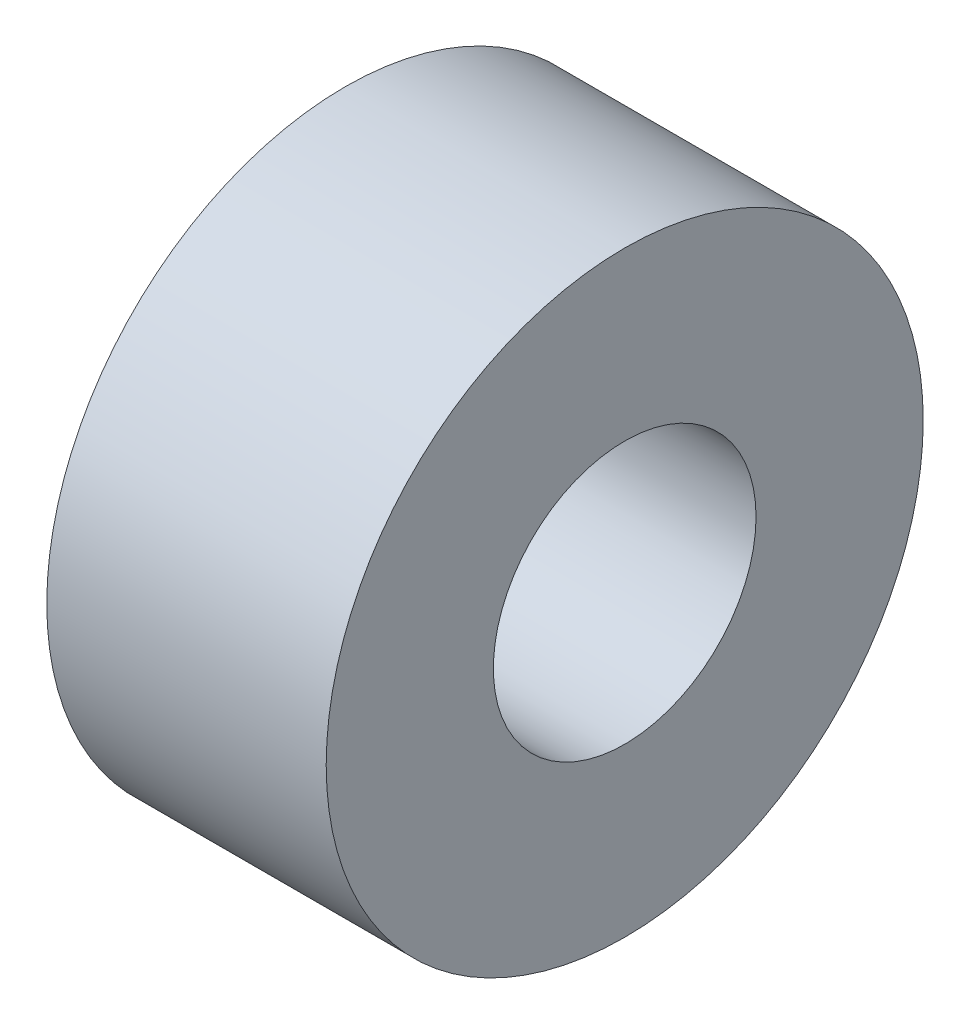
ISO-10303-21;
HEADER;
FILE_DESCRIPTION(('STEP AP214'),'2;1');
FILE_NAME('part.step','',(''),(''),'','','');
FILE_SCHEMA(('AUTOMOTIVE_DESIGN { 1 0 10303 214 1 1 1 1 }'));
ENDSEC;
DATA;
#1=APPLICATION_CONTEXT('core data for automotive mechanical design processes');
#2=APPLICATION_PROTOCOL_DEFINITION('international standard','automotive_design',2000,#1);
#3=PRODUCT_CONTEXT('',#1,'mechanical');
#4=PRODUCT('Part','Part','',(#3));
#5=PRODUCT_RELATED_PRODUCT_CATEGORY('part','',(#4));
#6=PRODUCT_DEFINITION_FORMATION('','',#4);
#7=PRODUCT_DEFINITION_CONTEXT('part definition',#1,'design');
#8=PRODUCT_DEFINITION('design','',#6,#7);
#9=PRODUCT_DEFINITION_SHAPE('','',#8);
#10=(LENGTH_UNIT() NAMED_UNIT(*) SI_UNIT(.MILLI.,.METRE.));
#11=(NAMED_UNIT(*) PLANE_ANGLE_UNIT() SI_UNIT($,.RADIAN.));
#12=(NAMED_UNIT(*) SI_UNIT($,.STERADIAN.) SOLID_ANGLE_UNIT());
#13=UNCERTAINTY_MEASURE_WITH_UNIT(LENGTH_MEASURE(1.E-05),#10,'distance_accuracy_value','');
#14=(GEOMETRIC_REPRESENTATION_CONTEXT(3) GLOBAL_UNCERTAINTY_ASSIGNED_CONTEXT((#13)) GLOBAL_UNIT_ASSIGNED_CONTEXT((#10,
#11,#12)) REPRESENTATION_CONTEXT('',''));
#15=CARTESIAN_POINT('',(0.,0.,0.));
#16=DIRECTION('',(0.,0.,1.));
#17=DIRECTION('',(1.,0.,0.));
#18=AXIS2_PLACEMENT_3D('',#15,#16,#17);
#19=CARTESIAN_POINT('',(2.9718,0.,0.));
#20=DIRECTION('',(1.,0.,0.));
#21=DIRECTION('',(0.,0.,-1.));
#22=AXIS2_PLACEMENT_3D('',#19,#20,#21);
#23=PLANE('',#22);
#24=CARTESIAN_POINT('',(2.9718,0.,0.));
#25=DIRECTION('',(1.,0.,0.));
#26=DIRECTION('',(0.,0.,-1.));
#27=AXIS2_PLACEMENT_3D('',#24,#25,#26);
#28=CIRCLE('',#27,3.175);
#29=CARTESIAN_POINT('',(2.9718,0.,-3.175));
#30=VERTEX_POINT('',#29);
#31=EDGE_CURVE('E10',#30,#30,#28,.T.);
#32=ORIENTED_EDGE('',*,*,#31,.T.);
#33=EDGE_LOOP('',(#32));
#34=FACE_BOUND('',#33,.T.);
#35=CARTESIAN_POINT('',(2.9718,0.,0.));
#36=DIRECTION('',(1.,0.,0.));
#37=DIRECTION('',(0.,0.,-1.));
#38=AXIS2_PLACEMENT_3D('',#35,#36,#37);
#39=CIRCLE('',#38,1.397);
#40=CARTESIAN_POINT('',(2.9718,0.,-1.397));
#41=VERTEX_POINT('',#40);
#42=EDGE_CURVE('E50',#41,#41,#39,.T.);
#43=ORIENTED_EDGE('',*,*,#42,.F.);
#44=EDGE_LOOP('',(#43));
#45=FACE_BOUND('',#44,.T.);
#46=ADVANCED_FACE('F39',(#34,#45),#23,.T.);
#47=CARTESIAN_POINT('',(0.,0.,0.));
#48=DIRECTION('',(1.,0.,0.));
#49=DIRECTION('',(0.,0.,-1.));
#50=AXIS2_PLACEMENT_3D('',#47,#48,#49);
#51=PLANE('',#50);
#52=CARTESIAN_POINT('',(0.,0.,0.));
#53=DIRECTION('',(1.,0.,0.));
#54=DIRECTION('',(0.,0.,-1.));
#55=AXIS2_PLACEMENT_3D('',#52,#53,#54);
#56=CIRCLE('',#55,3.175);
#57=CARTESIAN_POINT('',(0.,0.,-3.175));
#58=VERTEX_POINT('',#57);
#59=EDGE_CURVE('E43',#58,#58,#56,.T.);
#60=ORIENTED_EDGE('',*,*,#59,.F.);
#61=EDGE_LOOP('',(#60));
#62=FACE_BOUND('',#61,.T.);
#63=CARTESIAN_POINT('',(0.,0.,0.));
#64=DIRECTION('',(1.,0.,0.));
#65=DIRECTION('',(0.,0.,-1.));
#66=AXIS2_PLACEMENT_3D('',#63,#64,#65);
#67=CIRCLE('',#66,1.397);
#68=CARTESIAN_POINT('',(0.,0.,-1.397));
#69=VERTEX_POINT('',#68);
#70=EDGE_CURVE('E52',#69,#69,#67,.T.);
#71=ORIENTED_EDGE('',*,*,#70,.T.);
#72=EDGE_LOOP('',(#71));
#73=FACE_BOUND('',#72,.T.);
#74=ADVANCED_FACE('F62',(#62,#73),#51,.F.);
#75=CARTESIAN_POINT('',(2.9718,0.,0.));
#76=DIRECTION('',(-1.,0.,0.));
#77=DIRECTION('',(0.,0.,1.));
#78=AXIS2_PLACEMENT_3D('',#75,#76,#77);
#79=CYLINDRICAL_SURFACE('',#78,3.175);
#80=ORIENTED_EDGE('',*,*,#31,.F.);
#81=EDGE_LOOP('',(#80));
#82=FACE_BOUND('',#81,.T.);
#83=ORIENTED_EDGE('',*,*,#59,.T.);
#84=EDGE_LOOP('',(#83));
#85=FACE_BOUND('',#84,.T.);
#86=ADVANCED_FACE('F41',(#82,#85),#79,.T.);
#87=CARTESIAN_POINT('',(2.9718,0.,0.));
#88=DIRECTION('',(-1.,0.,0.));
#89=DIRECTION('',(0.,0.,1.));
#90=AXIS2_PLACEMENT_3D('',#87,#88,#89);
#91=CYLINDRICAL_SURFACE('',#90,1.397);
#92=ORIENTED_EDGE('',*,*,#42,.T.);
#93=EDGE_LOOP('',(#92));
#94=FACE_BOUND('',#93,.T.);
#95=ORIENTED_EDGE('',*,*,#70,.F.);
#96=EDGE_LOOP('',(#95));
#97=FACE_BOUND('',#96,.T.);
#98=ADVANCED_FACE('F58',(#94,#97),#91,.F.);
#99=CLOSED_SHELL('',(#46,#74,#86,#98));
#100=MANIFOLD_SOLID_BREP('B2',#99);
#101=ADVANCED_BREP_SHAPE_REPRESENTATION('',(#18,#100),#14);
#102=SHAPE_DEFINITION_REPRESENTATION(#9,#101);
ENDSEC;
END-ISO-10303-21;
